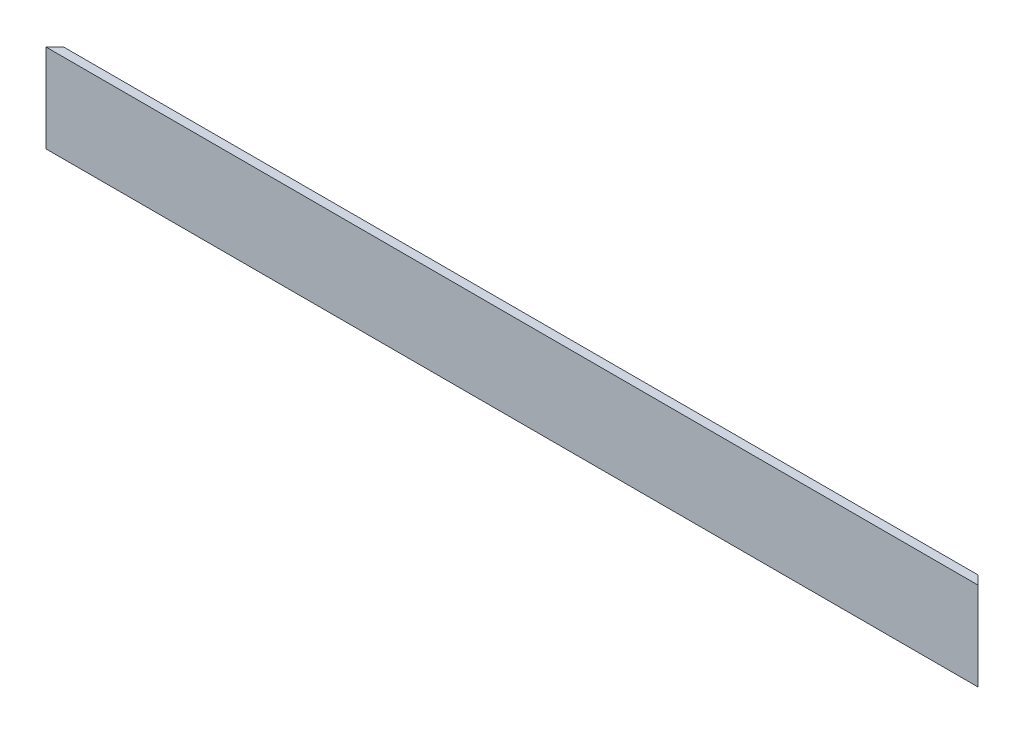
ISO-10303-21;
HEADER;
FILE_DESCRIPTION(('STEP AP214'),'2;1');
FILE_NAME('part.step','',(''),(''),'','','');
FILE_SCHEMA(('AUTOMOTIVE_DESIGN { 1 0 10303 214 1 1 1 1 }'));
ENDSEC;
DATA;
#1=APPLICATION_CONTEXT('core data for automotive mechanical design processes');
#2=APPLICATION_PROTOCOL_DEFINITION('international standard','automotive_design',2000,#1);
#3=PRODUCT_CONTEXT('',#1,'mechanical');
#4=PRODUCT('Part','Part','',(#3));
#5=PRODUCT_RELATED_PRODUCT_CATEGORY('part','',(#4));
#6=PRODUCT_DEFINITION_FORMATION('','',#4);
#7=PRODUCT_DEFINITION_CONTEXT('part definition',#1,'design');
#8=PRODUCT_DEFINITION('design','',#6,#7);
#9=PRODUCT_DEFINITION_SHAPE('','',#8);
#10=(LENGTH_UNIT() NAMED_UNIT(*) SI_UNIT(.MILLI.,.METRE.));
#11=(NAMED_UNIT(*) PLANE_ANGLE_UNIT() SI_UNIT($,.RADIAN.));
#12=(NAMED_UNIT(*) SI_UNIT($,.STERADIAN.) SOLID_ANGLE_UNIT());
#13=UNCERTAINTY_MEASURE_WITH_UNIT(LENGTH_MEASURE(1.E-05),#10,'distance_accuracy_value','');
#14=(GEOMETRIC_REPRESENTATION_CONTEXT(3) GLOBAL_UNCERTAINTY_ASSIGNED_CONTEXT((#13)) GLOBAL_UNIT_ASSIGNED_CONTEXT((#10,
#11,#12)) REPRESENTATION_CONTEXT('',''));
#15=CARTESIAN_POINT('',(0.,0.,0.));
#16=DIRECTION('',(0.,0.,1.));
#17=DIRECTION('',(1.,0.,0.));
#18=AXIS2_PLACEMENT_3D('',#15,#16,#17);
#19=CARTESIAN_POINT('',(-528.,100.,-5.));
#20=DIRECTION('',(0.,0.,1.));
#21=DIRECTION('',(1.,0.,0.));
#22=AXIS2_PLACEMENT_3D('',#19,#20,#21);
#23=PLANE('',#22);
#24=DIRECTION('',(0.,1.,0.));
#25=VECTOR('',#24,1.);
#26=CARTESIAN_POINT('',(518.,0.,-5.));
#27=LINE('',#26,#25);
#28=CARTESIAN_POINT('',(518.,98.75,-5.));
#29=VERTEX_POINT('',#28);
#30=CARTESIAN_POINT('',(518.,100.,-5.));
#31=VERTEX_POINT('',#30);
#32=EDGE_CURVE('E129',#29,#31,#27,.T.);
#33=ORIENTED_EDGE('',*,*,#32,.F.);
#34=DIRECTION('',(1.,0.,0.));
#35=VECTOR('',#34,1.);
#36=CARTESIAN_POINT('',(528.,98.75,-5.));
#37=LINE('',#36,#35);
#38=CARTESIAN_POINT('',(-518.,98.75,-5.));
#39=VERTEX_POINT('',#38);
#40=EDGE_CURVE('E122',#39,#29,#37,.T.);
#41=ORIENTED_EDGE('',*,*,#40,.F.);
#42=DIRECTION('',(0.,1.,0.));
#43=VECTOR('',#42,1.);
#44=CARTESIAN_POINT('',(-518.,0.,-5.));
#45=LINE('',#44,#43);
#46=CARTESIAN_POINT('',(-518.,100.,-5.));
#47=VERTEX_POINT('',#46);
#48=EDGE_CURVE('E188',#39,#47,#45,.T.);
#49=ORIENTED_EDGE('',*,*,#48,.T.);
#50=DIRECTION('',(-1.,0.,0.));
#51=VECTOR('',#50,1.);
#52=CARTESIAN_POINT('',(-528.,100.,-5.));
#53=LINE('',#52,#51);
#54=EDGE_CURVE('E140',#31,#47,#53,.T.);
#55=ORIENTED_EDGE('',*,*,#54,.F.);
#56=EDGE_LOOP('',(#33,#41,#49,#55));
#57=FACE_BOUND('',#56,.T.);
#58=ADVANCED_FACE('F39',(#57),#23,.F.);
#59=CARTESIAN_POINT('',(-518.,0.,-4.99999999999997));
#60=VERTEX_POINT('',#59);
#61=CARTESIAN_POINT('',(-518.,1.25,-5.));
#62=VERTEX_POINT('',#61);
#63=EDGE_CURVE('E63',#60,#62,#45,.T.);
#64=ORIENTED_EDGE('',*,*,#63,.T.);
#65=DIRECTION('',(-1.,0.,0.));
#66=VECTOR('',#65,1.);
#67=CARTESIAN_POINT('',(528.,1.25,-5.));
#68=LINE('',#67,#66);
#69=CARTESIAN_POINT('',(518.,1.25,-5.));
#70=VERTEX_POINT('',#69);
#71=EDGE_CURVE('E108',#70,#62,#68,.T.);
#72=ORIENTED_EDGE('',*,*,#71,.F.);
#73=CARTESIAN_POINT('',(518.,0.,-5.));
#74=VERTEX_POINT('',#73);
#75=EDGE_CURVE('E119',#74,#70,#27,.T.);
#76=ORIENTED_EDGE('',*,*,#75,.F.);
#77=DIRECTION('',(-1.,0.,0.));
#78=VECTOR('',#77,1.);
#79=CARTESIAN_POINT('',(-528.,0.,-5.));
#80=LINE('',#79,#78);
#81=EDGE_CURVE('E150',#74,#60,#80,.T.);
#82=ORIENTED_EDGE('',*,*,#81,.T.);
#83=EDGE_LOOP('',(#64,#72,#76,#82));
#84=FACE_BOUND('',#83,.T.);
#85=ADVANCED_FACE('F41',(#84),#23,.F.);
#86=CARTESIAN_POINT('',(-528.,100.,5.));
#87=DIRECTION('',(0.,0.,-1.));
#88=DIRECTION('',(-1.,0.,0.));
#89=AXIS2_PLACEMENT_3D('',#86,#87,#88);
#90=PLANE('',#89);
#91=DIRECTION('',(1.,0.,0.));
#92=VECTOR('',#91,1.);
#93=CARTESIAN_POINT('',(-528.,0.,5.));
#94=LINE('',#93,#92);
#95=CARTESIAN_POINT('',(-528.,0.,5.));
#96=VERTEX_POINT('',#95);
#97=CARTESIAN_POINT('',(528.,0.,5.));
#98=VERTEX_POINT('',#97);
#99=EDGE_CURVE('E145',#96,#98,#94,.T.);
#100=ORIENTED_EDGE('',*,*,#99,.T.);
#101=DIRECTION('',(0.,-1.,0.));
#102=VECTOR('',#101,1.);
#103=CARTESIAN_POINT('',(528.,100.,5.));
#104=LINE('',#103,#102);
#105=CARTESIAN_POINT('',(528.,100.,5.));
#106=VERTEX_POINT('',#105);
#107=EDGE_CURVE('E149',#106,#98,#104,.T.);
#108=ORIENTED_EDGE('',*,*,#107,.F.);
#109=DIRECTION('',(1.,0.,0.));
#110=VECTOR('',#109,1.);
#111=CARTESIAN_POINT('',(-528.,100.,5.));
#112=LINE('',#111,#110);
#113=CARTESIAN_POINT('',(-528.,100.,5.));
#114=VERTEX_POINT('',#113);
#115=EDGE_CURVE('E144',#114,#106,#112,.T.);
#116=ORIENTED_EDGE('',*,*,#115,.F.);
#117=DIRECTION('',(0.,-1.,0.));
#118=VECTOR('',#117,1.);
#119=CARTESIAN_POINT('',(-528.,100.,5.));
#120=LINE('',#119,#118);
#121=EDGE_CURVE('E158',#114,#96,#120,.T.);
#122=ORIENTED_EDGE('',*,*,#121,.T.);
#123=EDGE_LOOP('',(#100,#108,#116,#122));
#124=FACE_BOUND('',#123,.T.);
#125=ADVANCED_FACE('F204',(#124),#90,.F.);
#126=CARTESIAN_POINT('',(0.,100.,0.));
#127=DIRECTION('',(0.,1.,0.));
#128=DIRECTION('',(0.,0.,1.));
#129=AXIS2_PLACEMENT_3D('',#126,#127,#128);
#130=PLANE('',#129);
#131=DIRECTION('',(0.707106781186548,0.,-0.707106781186547));
#132=VECTOR('',#131,1.);
#133=CARTESIAN_POINT('',(-528.,100.,5.));
#134=LINE('',#133,#132);
#135=EDGE_CURVE('E128',#114,#47,#134,.T.);
#136=ORIENTED_EDGE('',*,*,#135,.F.);
#137=ORIENTED_EDGE('',*,*,#115,.T.);
#138=DIRECTION('',(0.707106781186548,0.,0.707106781186547));
#139=VECTOR('',#138,1.);
#140=CARTESIAN_POINT('',(528.,100.,5.));
#141=LINE('',#140,#139);
#142=EDGE_CURVE('E138',#31,#106,#141,.T.);
#143=ORIENTED_EDGE('',*,*,#142,.F.);
#144=ORIENTED_EDGE('',*,*,#54,.T.);
#145=EDGE_LOOP('',(#136,#137,#143,#144));
#146=FACE_BOUND('',#145,.T.);
#147=ADVANCED_FACE('F202',(#146),#130,.T.);
#148=CARTESIAN_POINT('',(0.,0.,0.));
#149=DIRECTION('',(0.,1.,0.));
#150=DIRECTION('',(0.,0.,1.));
#151=AXIS2_PLACEMENT_3D('',#148,#149,#150);
#152=PLANE('',#151);
#153=ORIENTED_EDGE('',*,*,#99,.F.);
#154=DIRECTION('',(0.707106781186548,0.,-0.707106781186547));
#155=VECTOR('',#154,1.);
#156=CARTESIAN_POINT('',(-528.,0.,5.));
#157=LINE('',#156,#155);
#158=EDGE_CURVE('E134',#96,#60,#157,.T.);
#159=ORIENTED_EDGE('',*,*,#158,.T.);
#160=ORIENTED_EDGE('',*,*,#81,.F.);
#161=DIRECTION('',(0.707106781186548,0.,0.707106781186547));
#162=VECTOR('',#161,1.);
#163=CARTESIAN_POINT('',(528.,0.,5.));
#164=LINE('',#163,#162);
#165=EDGE_CURVE('E126',#74,#98,#164,.T.);
#166=ORIENTED_EDGE('',*,*,#165,.T.);
#167=EDGE_LOOP('',(#153,#159,#160,#166));
#168=FACE_BOUND('',#167,.T.);
#169=ADVANCED_FACE('F205',(#168),#152,.F.);
#170=CARTESIAN_POINT('',(528.,0.,5.));
#171=DIRECTION('',(-0.707106781186547,0.,0.707106781186548));
#172=DIRECTION('',(0.707106781186548,0.,0.707106781186547));
#173=AXIS2_PLACEMENT_3D('',#170,#171,#172);
#174=PLANE('',#173);
#175=DIRECTION('',(0.,-1.,0.));
#176=VECTOR('',#175,1.);
#177=CARTESIAN_POINT('',(526.,0.,3.));
#178=LINE('',#177,#176);
#179=CARTESIAN_POINT('',(526.,98.75,3.));
#180=VERTEX_POINT('',#179);
#181=CARTESIAN_POINT('',(526.,1.25,3.));
#182=VERTEX_POINT('',#181);
#183=EDGE_CURVE('E114',#180,#182,#178,.T.);
#184=ORIENTED_EDGE('',*,*,#183,.F.);
#185=DIRECTION('',(-0.707106781186548,0.,-0.707106781186547));
#186=VECTOR('',#185,1.);
#187=CARTESIAN_POINT('',(528.,98.75,5.));
#188=LINE('',#187,#186);
#189=EDGE_CURVE('E113',#180,#29,#188,.T.);
#190=ORIENTED_EDGE('',*,*,#189,.T.);
#191=ORIENTED_EDGE('',*,*,#32,.T.);
#192=ORIENTED_EDGE('',*,*,#142,.T.);
#193=ORIENTED_EDGE('',*,*,#107,.T.);
#194=ORIENTED_EDGE('',*,*,#165,.F.);
#195=ORIENTED_EDGE('',*,*,#75,.T.);
#196=DIRECTION('',(0.707106781186548,0.,0.707106781186547));
#197=VECTOR('',#196,1.);
#198=CARTESIAN_POINT('',(528.,1.25,5.));
#199=LINE('',#198,#197);
#200=EDGE_CURVE('E105',#70,#182,#199,.T.);
#201=ORIENTED_EDGE('',*,*,#200,.T.);
#202=EDGE_LOOP('',(#184,#190,#191,#192,#193,#194,#195,#201));
#203=FACE_BOUND('',#202,.T.);
#204=ADVANCED_FACE('F124',(#203),#174,.F.);
#205=CARTESIAN_POINT('',(-528.,0.,5.));
#206=DIRECTION('',(0.707106781186547,0.,0.707106781186548));
#207=DIRECTION('',(0.707106781186548,0.,-0.707106781186547));
#208=AXIS2_PLACEMENT_3D('',#205,#206,#207);
#209=PLANE('',#208);
#210=ORIENTED_EDGE('',*,*,#48,.F.);
#211=DIRECTION('',(-0.707106781186548,0.,0.707106781186547));
#212=VECTOR('',#211,1.);
#213=CARTESIAN_POINT('',(-528.,98.75,5.));
#214=LINE('',#213,#212);
#215=CARTESIAN_POINT('',(-526.,98.75,3.));
#216=VERTEX_POINT('',#215);
#217=EDGE_CURVE('E11',#39,#216,#214,.T.);
#218=ORIENTED_EDGE('',*,*,#217,.T.);
#219=DIRECTION('',(0.,1.,0.));
#220=VECTOR('',#219,1.);
#221=CARTESIAN_POINT('',(-526.,0.,3.));
#222=LINE('',#221,#220);
#223=CARTESIAN_POINT('',(-526.,1.25,3.));
#224=VERTEX_POINT('',#223);
#225=EDGE_CURVE('E162',#224,#216,#222,.T.);
#226=ORIENTED_EDGE('',*,*,#225,.F.);
#227=DIRECTION('',(0.707106781186548,0.,-0.707106781186547));
#228=VECTOR('',#227,1.);
#229=CARTESIAN_POINT('',(-528.,1.25,5.));
#230=LINE('',#229,#228);
#231=EDGE_CURVE('E48',#224,#62,#230,.T.);
#232=ORIENTED_EDGE('',*,*,#231,.T.);
#233=ORIENTED_EDGE('',*,*,#63,.F.);
#234=ORIENTED_EDGE('',*,*,#158,.F.);
#235=ORIENTED_EDGE('',*,*,#121,.F.);
#236=ORIENTED_EDGE('',*,*,#135,.T.);
#237=EDGE_LOOP('',(#210,#218,#226,#232,#233,#234,#235,#236));
#238=FACE_BOUND('',#237,.T.);
#239=ADVANCED_FACE('F167',(#238),#209,.F.);
#240=CARTESIAN_POINT('',(528.,98.75,3.));
#241=DIRECTION('',(0.,1.,0.));
#242=DIRECTION('',(0.,0.,1.));
#243=AXIS2_PLACEMENT_3D('',#240,#241,#242);
#244=PLANE('',#243);
#245=DIRECTION('',(1.,0.,0.));
#246=VECTOR('',#245,1.);
#247=CARTESIAN_POINT('',(528.,98.75,3.));
#248=LINE('',#247,#246);
#249=EDGE_CURVE('E171',#216,#180,#248,.T.);
#250=ORIENTED_EDGE('',*,*,#249,.F.);
#251=ORIENTED_EDGE('',*,*,#217,.F.);
#252=ORIENTED_EDGE('',*,*,#40,.T.);
#253=ORIENTED_EDGE('',*,*,#189,.F.);
#254=EDGE_LOOP('',(#250,#251,#252,#253));
#255=FACE_BOUND('',#254,.T.);
#256=ADVANCED_FACE('F173',(#255),#244,.F.);
#257=CARTESIAN_POINT('',(528.,1.25,3.));
#258=DIRECTION('',(0.,-1.,0.));
#259=DIRECTION('',(1.,0.,0.));
#260=AXIS2_PLACEMENT_3D('',#257,#258,#259);
#261=PLANE('',#260);
#262=ORIENTED_EDGE('',*,*,#71,.T.);
#263=ORIENTED_EDGE('',*,*,#231,.F.);
#264=DIRECTION('',(-1.,0.,0.));
#265=VECTOR('',#264,1.);
#266=CARTESIAN_POINT('',(528.,1.25,3.));
#267=LINE('',#266,#265);
#268=EDGE_CURVE('E55',#182,#224,#267,.T.);
#269=ORIENTED_EDGE('',*,*,#268,.F.);
#270=ORIENTED_EDGE('',*,*,#200,.F.);
#271=EDGE_LOOP('',(#262,#263,#269,#270));
#272=FACE_BOUND('',#271,.T.);
#273=ADVANCED_FACE('F107',(#272),#261,.F.);
#274=CARTESIAN_POINT('',(0.,0.,3.));
#275=DIRECTION('',(0.,0.,-1.));
#276=DIRECTION('',(-1.,0.,0.));
#277=AXIS2_PLACEMENT_3D('',#274,#275,#276);
#278=PLANE('',#277);
#279=ORIENTED_EDGE('',*,*,#183,.T.);
#280=ORIENTED_EDGE('',*,*,#268,.T.);
#281=ORIENTED_EDGE('',*,*,#225,.T.);
#282=ORIENTED_EDGE('',*,*,#249,.T.);
#283=EDGE_LOOP('',(#279,#280,#281,#282));
#284=FACE_BOUND('',#283,.T.);
#285=ADVANCED_FACE('F170',(#284),#278,.T.);
#286=CLOSED_SHELL('',(#58,#85,#125,#147,#169,#204,#239,#256,#273,#285));
#287=MANIFOLD_SOLID_BREP('B2',#286);
#288=ADVANCED_BREP_SHAPE_REPRESENTATION('',(#18,#287),#14);
#289=SHAPE_DEFINITION_REPRESENTATION(#9,#288);
ENDSEC;
END-ISO-10303-21;
